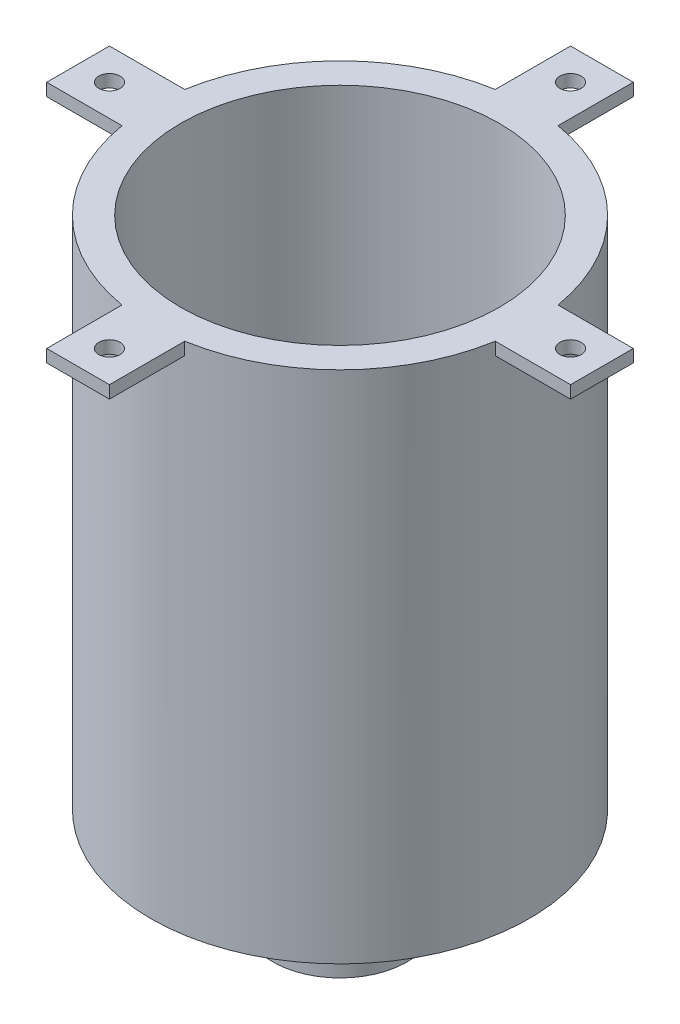
ISO-10303-21;
HEADER;
FILE_DESCRIPTION(('STEP AP214'),'2;1');
FILE_NAME('part.step','',(''),(''),'','','');
FILE_SCHEMA(('AUTOMOTIVE_DESIGN { 1 0 10303 214 1 1 1 1 }'));
ENDSEC;
DATA;
#1=APPLICATION_CONTEXT('core data for automotive mechanical design processes');
#2=APPLICATION_PROTOCOL_DEFINITION('international standard','automotive_design',2000,#1);
#3=PRODUCT_CONTEXT('',#1,'mechanical');
#4=PRODUCT('Part','Part','',(#3));
#5=PRODUCT_RELATED_PRODUCT_CATEGORY('part','',(#4));
#6=PRODUCT_DEFINITION_FORMATION('','',#4);
#7=PRODUCT_DEFINITION_CONTEXT('part definition',#1,'design');
#8=PRODUCT_DEFINITION('design','',#6,#7);
#9=PRODUCT_DEFINITION_SHAPE('','',#8);
#10=(LENGTH_UNIT() NAMED_UNIT(*) SI_UNIT(.MILLI.,.METRE.));
#11=(NAMED_UNIT(*) PLANE_ANGLE_UNIT() SI_UNIT($,.RADIAN.));
#12=(NAMED_UNIT(*) SI_UNIT($,.STERADIAN.) SOLID_ANGLE_UNIT());
#13=UNCERTAINTY_MEASURE_WITH_UNIT(LENGTH_MEASURE(1.E-05),#10,'distance_accuracy_value','');
#14=(GEOMETRIC_REPRESENTATION_CONTEXT(3) GLOBAL_UNCERTAINTY_ASSIGNED_CONTEXT((#13)) GLOBAL_UNIT_ASSIGNED_CONTEXT((#10,
#11,#12)) REPRESENTATION_CONTEXT('',''));
#15=CARTESIAN_POINT('',(0.,0.,0.));
#16=DIRECTION('',(0.,0.,1.));
#17=DIRECTION('',(1.,0.,0.));
#18=AXIS2_PLACEMENT_3D('',#15,#16,#17);
#19=CARTESIAN_POINT('',(0.,17.7,0.));
#20=DIRECTION('',(0.,1.,0.));
#21=DIRECTION('',(0.,0.,1.));
#22=AXIS2_PLACEMENT_3D('',#19,#20,#21);
#23=PLANE('',#22);
#24=CARTESIAN_POINT('',(0.,17.7,0.));
#25=DIRECTION('',(0.,1.,0.));
#26=DIRECTION('',(0.,0.,1.));
#27=AXIS2_PLACEMENT_3D('',#24,#25,#26);
#28=CIRCLE('',#27,7.874);
#29=CARTESIAN_POINT('',(0.,17.7,7.874));
#30=VERTEX_POINT('',#29);
#31=EDGE_CURVE('E301',#30,#30,#28,.T.);
#32=ORIENTED_EDGE('',*,*,#31,.F.);
#33=EDGE_LOOP('',(#32));
#34=FACE_BOUND('',#33,.T.);
#35=CARTESIAN_POINT('',(0.,17.7,0.));
#36=DIRECTION('',(0.,1.,0.));
#37=DIRECTION('',(0.,0.,1.));
#38=AXIS2_PLACEMENT_3D('',#35,#36,#37);
#39=CIRCLE('',#38,25.4);
#40=CARTESIAN_POINT('',(0.,17.7,25.4));
#41=VERTEX_POINT('',#40);
#42=EDGE_CURVE('E12',#41,#41,#39,.F.);
#43=ORIENTED_EDGE('',*,*,#42,.F.);
#44=EDGE_LOOP('',(#43));
#45=FACE_BOUND('',#44,.T.);
#46=ADVANCED_FACE('F36',(#34,#45),#23,.T.);
#47=CARTESIAN_POINT('',(0.,47.701,0.));
#48=DIRECTION('',(0.,-1.,0.));
#49=DIRECTION('',(0.,0.,-1.));
#50=AXIS2_PLACEMENT_3D('',#47,#48,#49);
#51=CYLINDRICAL_SURFACE('',#50,10.705);
#52=CARTESIAN_POINT('',(0.,0.,0.));
#53=DIRECTION('',(0.,-1.,0.));
#54=DIRECTION('',(0.,0.,-1.));
#55=AXIS2_PLACEMENT_3D('',#52,#53,#54);
#56=CIRCLE('',#55,10.705);
#57=CARTESIAN_POINT('',(0.,0.,-10.705));
#58=VERTEX_POINT('',#57);
#59=EDGE_CURVE('E44',#58,#58,#56,.T.);
#60=ORIENTED_EDGE('',*,*,#59,.F.);
#61=EDGE_LOOP('',(#60));
#62=FACE_BOUND('',#61,.T.);
#63=CARTESIAN_POINT('',(0.,15.7,0.));
#64=DIRECTION('',(0.,1.,0.));
#65=DIRECTION('',(0.,0.,1.));
#66=AXIS2_PLACEMENT_3D('',#63,#64,#65);
#67=CIRCLE('',#66,10.705);
#68=CARTESIAN_POINT('',(0.,15.7,10.705));
#69=VERTEX_POINT('',#68);
#70=EDGE_CURVE('E308',#69,#69,#67,.F.);
#71=ORIENTED_EDGE('',*,*,#70,.T.);
#72=EDGE_LOOP('',(#71));
#73=FACE_BOUND('',#72,.T.);
#74=ADVANCED_FACE('F317',(#62,#73),#51,.T.);
#75=CARTESIAN_POINT('',(0.,47.701,0.));
#76=DIRECTION('',(0.,-1.,0.));
#77=DIRECTION('',(0.,0.,-1.));
#78=AXIS2_PLACEMENT_3D('',#75,#76,#77);
#79=CYLINDRICAL_SURFACE('',#78,7.874);
#80=CARTESIAN_POINT('',(0.,0.,0.));
#81=DIRECTION('',(0.,-1.,0.));
#82=DIRECTION('',(0.,0.,-1.));
#83=AXIS2_PLACEMENT_3D('',#80,#81,#82);
#84=CIRCLE('',#83,7.874);
#85=CARTESIAN_POINT('',(0.,0.,-7.874));
#86=VERTEX_POINT('',#85);
#87=EDGE_CURVE('E311',#86,#86,#84,.T.);
#88=ORIENTED_EDGE('',*,*,#87,.T.);
#89=EDGE_LOOP('',(#88));
#90=FACE_BOUND('',#89,.T.);
#91=ORIENTED_EDGE('',*,*,#31,.T.);
#92=EDGE_LOOP('',(#91));
#93=FACE_BOUND('',#92,.T.);
#94=ADVANCED_FACE('F320',(#90,#93),#79,.F.);
#95=CARTESIAN_POINT('',(8.3,0.,0.));
#96=DIRECTION('',(0.,-1.,0.));
#97=DIRECTION('',(0.,0.,-1.));
#98=AXIS2_PLACEMENT_3D('',#95,#96,#97);
#99=PLANE('',#98);
#100=ORIENTED_EDGE('',*,*,#87,.F.);
#101=EDGE_LOOP('',(#100));
#102=FACE_BOUND('',#101,.T.);
#103=ORIENTED_EDGE('',*,*,#59,.T.);
#104=EDGE_LOOP('',(#103));
#105=FACE_BOUND('',#104,.T.);
#106=ADVANCED_FACE('F38',(#102,#105),#99,.T.);
#107=CARTESIAN_POINT('',(0.,15.7,0.));
#108=DIRECTION('',(0.,1.,0.));
#109=DIRECTION('',(0.,0.,1.));
#110=AXIS2_PLACEMENT_3D('',#107,#108,#109);
#111=PLANE('',#110);
#112=ORIENTED_EDGE('',*,*,#70,.F.);
#113=EDGE_LOOP('',(#112));
#114=FACE_BOUND('',#113,.T.);
#115=CARTESIAN_POINT('',(0.,15.7,0.));
#116=DIRECTION('',(0.,1.,0.));
#117=DIRECTION('',(0.,0.,1.));
#118=AXIS2_PLACEMENT_3D('',#115,#116,#117);
#119=CIRCLE('',#118,30.1625);
#120=CARTESIAN_POINT('',(0.,15.7,30.1625));
#121=VERTEX_POINT('',#120);
#122=EDGE_CURVE('E305',#121,#121,#119,.T.);
#123=ORIENTED_EDGE('',*,*,#122,.F.);
#124=EDGE_LOOP('',(#123));
#125=FACE_BOUND('',#124,.T.);
#126=ADVANCED_FACE('F323',(#114,#125),#111,.F.);
#127=CARTESIAN_POINT('',(0.,17.7,0.));
#128=DIRECTION('',(0.,-1.,0.));
#129=DIRECTION('',(0.,0.,-1.));
#130=AXIS2_PLACEMENT_3D('',#127,#128,#129);
#131=CYLINDRICAL_SURFACE('',#130,30.1625);
#132=CARTESIAN_POINT('',(0.,95.7,0.));
#133=DIRECTION('',(0.,1.,0.));
#134=DIRECTION('',(0.,0.,1.));
#135=AXIS2_PLACEMENT_3D('',#132,#133,#134);
#136=CIRCLE('',#135,30.1625);
#137=CARTESIAN_POINT('',(5.00000000000002,95.7,-29.7451913130509));
#138=VERTEX_POINT('',#137);
#139=CARTESIAN_POINT('',(-5.00000000000002,95.7,-29.7451913130509));
#140=VERTEX_POINT('',#139);
#141=EDGE_CURVE('E156',#138,#140,#136,.T.);
#142=ORIENTED_EDGE('',*,*,#141,.F.);
#143=DIRECTION('',(0.,1.,0.));
#144=VECTOR('',#143,1.);
#145=CARTESIAN_POINT('',(5.00000000000002,95.7,-29.7451913130509));
#146=LINE('',#145,#144);
#147=CARTESIAN_POINT('',(5.00000000000002,97.7,-29.7451913130509));
#148=VERTEX_POINT('',#147);
#149=EDGE_CURVE('E189',#138,#148,#146,.T.);
#150=ORIENTED_EDGE('',*,*,#149,.T.);
#151=CARTESIAN_POINT('',(0.,97.7,0.));
#152=DIRECTION('',(0.,1.,0.));
#153=DIRECTION('',(0.,0.,1.));
#154=AXIS2_PLACEMENT_3D('',#151,#152,#153);
#155=CIRCLE('',#154,30.1625);
#156=CARTESIAN_POINT('',(29.7451913130509,97.7,-5.));
#157=VERTEX_POINT('',#156);
#158=EDGE_CURVE('E622',#157,#148,#155,.T.);
#159=ORIENTED_EDGE('',*,*,#158,.F.);
#160=DIRECTION('',(0.,1.,0.));
#161=VECTOR('',#160,1.);
#162=CARTESIAN_POINT('',(29.7451913130509,95.7,-5.));
#163=LINE('',#162,#161);
#164=CARTESIAN_POINT('',(29.7451913130509,95.7,-5.));
#165=VERTEX_POINT('',#164);
#166=EDGE_CURVE('E221',#165,#157,#163,.T.);
#167=ORIENTED_EDGE('',*,*,#166,.F.);
#168=CARTESIAN_POINT('',(0.,95.7,0.));
#169=DIRECTION('',(0.,1.,0.));
#170=DIRECTION('',(0.,0.,1.));
#171=AXIS2_PLACEMENT_3D('',#168,#169,#170);
#172=CIRCLE('',#171,30.1625);
#173=CARTESIAN_POINT('',(29.7451913130509,95.7,5.));
#174=VERTEX_POINT('',#173);
#175=EDGE_CURVE('E201',#174,#165,#172,.T.);
#176=ORIENTED_EDGE('',*,*,#175,.F.);
#177=DIRECTION('',(0.,1.,0.));
#178=VECTOR('',#177,1.);
#179=CARTESIAN_POINT('',(29.7451913130509,95.7,5.));
#180=LINE('',#179,#178);
#181=CARTESIAN_POINT('',(29.7451913130509,97.7,5.));
#182=VERTEX_POINT('',#181);
#183=EDGE_CURVE('E218',#174,#182,#180,.T.);
#184=ORIENTED_EDGE('',*,*,#183,.T.);
#185=CARTESIAN_POINT('',(5.00000000000002,97.7,29.7451913130509));
#186=VERTEX_POINT('',#185);
#187=EDGE_CURVE('E302',#186,#182,#155,.T.);
#188=ORIENTED_EDGE('',*,*,#187,.F.);
#189=DIRECTION('',(0.,1.,0.));
#190=VECTOR('',#189,1.);
#191=CARTESIAN_POINT('',(5.,95.7,29.7451913130509));
#192=LINE('',#191,#190);
#193=CARTESIAN_POINT('',(5.,95.7,29.7451913130509));
#194=VERTEX_POINT('',#193);
#195=EDGE_CURVE('E255',#194,#186,#192,.T.);
#196=ORIENTED_EDGE('',*,*,#195,.F.);
#197=CARTESIAN_POINT('',(0.,95.7,0.));
#198=DIRECTION('',(0.,1.,0.));
#199=DIRECTION('',(0.,0.,1.));
#200=AXIS2_PLACEMENT_3D('',#197,#198,#199);
#201=CIRCLE('',#200,30.1625);
#202=CARTESIAN_POINT('',(-5.,95.7,29.7451913130509));
#203=VERTEX_POINT('',#202);
#204=EDGE_CURVE('E237',#203,#194,#201,.T.);
#205=ORIENTED_EDGE('',*,*,#204,.F.);
#206=DIRECTION('',(0.,1.,0.));
#207=VECTOR('',#206,1.);
#208=CARTESIAN_POINT('',(-5.,95.7,29.7451913130509));
#209=LINE('',#208,#207);
#210=CARTESIAN_POINT('',(-5.,97.7,29.7451913130509));
#211=VERTEX_POINT('',#210);
#212=EDGE_CURVE('E251',#203,#211,#209,.T.);
#213=ORIENTED_EDGE('',*,*,#212,.T.);
#214=CARTESIAN_POINT('',(-29.7451913130509,97.7,5.00000000000002));
#215=VERTEX_POINT('',#214);
#216=EDGE_CURVE('E298',#215,#211,#155,.T.);
#217=ORIENTED_EDGE('',*,*,#216,.F.);
#218=DIRECTION('',(0.,1.,0.));
#219=VECTOR('',#218,1.);
#220=CARTESIAN_POINT('',(-29.7451913130509,95.7,4.99999999999997));
#221=LINE('',#220,#219);
#222=CARTESIAN_POINT('',(-29.7451913130509,95.7,4.99999999999997));
#223=VERTEX_POINT('',#222);
#224=EDGE_CURVE('E290',#223,#215,#221,.T.);
#225=ORIENTED_EDGE('',*,*,#224,.F.);
#226=CARTESIAN_POINT('',(0.,95.7,0.));
#227=DIRECTION('',(0.,1.,0.));
#228=DIRECTION('',(0.,0.,1.));
#229=AXIS2_PLACEMENT_3D('',#226,#227,#228);
#230=CIRCLE('',#229,30.1625);
#231=CARTESIAN_POINT('',(-29.7451913130509,95.7,-4.99999999999997));
#232=VERTEX_POINT('',#231);
#233=EDGE_CURVE('E272',#232,#223,#230,.T.);
#234=ORIENTED_EDGE('',*,*,#233,.F.);
#235=DIRECTION('',(0.,1.,0.));
#236=VECTOR('',#235,1.);
#237=CARTESIAN_POINT('',(-29.7451913130509,95.7,-4.99999999999997));
#238=LINE('',#237,#236);
#239=CARTESIAN_POINT('',(-29.7451913130509,97.7,-4.99999999999997));
#240=VERTEX_POINT('',#239);
#241=EDGE_CURVE('E286',#232,#240,#238,.T.);
#242=ORIENTED_EDGE('',*,*,#241,.T.);
#243=CARTESIAN_POINT('',(-5.00000000000002,97.7,-29.7451913130509));
#244=VERTEX_POINT('',#243);
#245=EDGE_CURVE('E297',#244,#240,#155,.T.);
#246=ORIENTED_EDGE('',*,*,#245,.F.);
#247=DIRECTION('',(0.,1.,0.));
#248=VECTOR('',#247,1.);
#249=CARTESIAN_POINT('',(-5.00000000000002,95.7,-29.7451913130509));
#250=LINE('',#249,#248);
#251=EDGE_CURVE('E165',#140,#244,#250,.T.);
#252=ORIENTED_EDGE('',*,*,#251,.F.);
#253=EDGE_LOOP('',(#142,#150,#159,#167,#176,#184,#188,#196,#205,#213,#217,#225,#234,#242,#246,#252));
#254=FACE_BOUND('',#253,.T.);
#255=ORIENTED_EDGE('',*,*,#122,.T.);
#256=EDGE_LOOP('',(#255));
#257=FACE_BOUND('',#256,.T.);
#258=ADVANCED_FACE('F326',(#254,#257),#131,.T.);
#259=CARTESIAN_POINT('',(0.,97.7,0.));
#260=DIRECTION('',(0.,1.,0.));
#261=DIRECTION('',(0.,0.,1.));
#262=AXIS2_PLACEMENT_3D('',#259,#260,#261);
#263=PLANE('',#262);
#264=ORIENTED_EDGE('',*,*,#216,.T.);
#265=DIRECTION('',(0.,0.,1.));
#266=VECTOR('',#265,1.);
#267=CARTESIAN_POINT('',(-5.00000000000001,97.7,0.));
#268=LINE('',#267,#266);
#269=CARTESIAN_POINT('',(-5.00000000000002,97.7,41.7451913130509));
#270=VERTEX_POINT('',#269);
#271=EDGE_CURVE('E243',#211,#270,#268,.T.);
#272=ORIENTED_EDGE('',*,*,#271,.T.);
#273=DIRECTION('',(1.,0.,0.));
#274=VECTOR('',#273,1.);
#275=CARTESIAN_POINT('',(0.,97.7,41.7451913130509));
#276=LINE('',#275,#274);
#277=CARTESIAN_POINT('',(5.00000000000002,97.7,41.7451913130509));
#278=VERTEX_POINT('',#277);
#279=EDGE_CURVE('E246',#270,#278,#276,.T.);
#280=ORIENTED_EDGE('',*,*,#279,.T.);
#281=DIRECTION('',(0.,0.,1.));
#282=VECTOR('',#281,1.);
#283=CARTESIAN_POINT('',(5.00000000000001,97.7,0.));
#284=LINE('',#283,#282);
#285=EDGE_CURVE('E229',#186,#278,#284,.T.);
#286=ORIENTED_EDGE('',*,*,#285,.F.);
#287=ORIENTED_EDGE('',*,*,#187,.T.);
#288=DIRECTION('',(1.,0.,0.));
#289=VECTOR('',#288,1.);
#290=CARTESIAN_POINT('',(0.,97.7,5.00000000000001));
#291=LINE('',#290,#289);
#292=CARTESIAN_POINT('',(41.7451913130509,97.7,5.));
#293=VERTEX_POINT('',#292);
#294=EDGE_CURVE('E197',#182,#293,#291,.T.);
#295=ORIENTED_EDGE('',*,*,#294,.T.);
#296=DIRECTION('',(0.,0.,1.));
#297=VECTOR('',#296,1.);
#298=CARTESIAN_POINT('',(41.7451913130509,97.7,0.));
#299=LINE('',#298,#297);
#300=CARTESIAN_POINT('',(41.7451913130509,97.7,-5.));
#301=VERTEX_POINT('',#300);
#302=EDGE_CURVE('E209',#301,#293,#299,.T.);
#303=ORIENTED_EDGE('',*,*,#302,.F.);
#304=DIRECTION('',(1.,0.,0.));
#305=VECTOR('',#304,1.);
#306=CARTESIAN_POINT('',(0.,97.7,-5.00000000000001));
#307=LINE('',#306,#305);
#308=EDGE_CURVE('E58',#157,#301,#307,.T.);
#309=ORIENTED_EDGE('',*,*,#308,.F.);
#310=ORIENTED_EDGE('',*,*,#158,.T.);
#311=DIRECTION('',(0.,0.,-1.));
#312=VECTOR('',#311,1.);
#313=CARTESIAN_POINT('',(5.00000000000002,97.7,0.));
#314=LINE('',#313,#312);
#315=CARTESIAN_POINT('',(5.00000000000002,97.7,-41.7451913130509));
#316=VERTEX_POINT('',#315);
#317=EDGE_CURVE('E174',#148,#316,#314,.T.);
#318=ORIENTED_EDGE('',*,*,#317,.T.);
#319=DIRECTION('',(1.,0.,0.));
#320=VECTOR('',#319,1.);
#321=CARTESIAN_POINT('',(0.,97.7,-41.7451913130509));
#322=LINE('',#321,#320);
#323=CARTESIAN_POINT('',(-5.00000000000002,97.7,-41.7451913130509));
#324=VERTEX_POINT('',#323);
#325=EDGE_CURVE('E182',#324,#316,#322,.T.);
#326=ORIENTED_EDGE('',*,*,#325,.F.);
#327=DIRECTION('',(0.,0.,-1.));
#328=VECTOR('',#327,1.);
#329=CARTESIAN_POINT('',(-5.00000000000002,97.7,0.));
#330=LINE('',#329,#328);
#331=EDGE_CURVE('E51',#244,#324,#330,.T.);
#332=ORIENTED_EDGE('',*,*,#331,.F.);
#333=ORIENTED_EDGE('',*,*,#245,.T.);
#334=DIRECTION('',(-1.,0.,0.));
#335=VECTOR('',#334,1.);
#336=CARTESIAN_POINT('',(0.,97.7,-5.00000000000001));
#337=LINE('',#336,#335);
#338=CARTESIAN_POINT('',(-41.7451913130509,97.7,-5.00000000000002));
#339=VERTEX_POINT('',#338);
#340=EDGE_CURVE('E278',#240,#339,#337,.T.);
#341=ORIENTED_EDGE('',*,*,#340,.T.);
#342=DIRECTION('',(0.,0.,1.));
#343=VECTOR('',#342,1.);
#344=CARTESIAN_POINT('',(-41.7451913130509,97.7,0.));
#345=LINE('',#344,#343);
#346=CARTESIAN_POINT('',(-41.7451913130509,97.7,5.00000000000002));
#347=VERTEX_POINT('',#346);
#348=EDGE_CURVE('E281',#339,#347,#345,.T.);
#349=ORIENTED_EDGE('',*,*,#348,.T.);
#350=DIRECTION('',(-1.,0.,0.));
#351=VECTOR('',#350,1.);
#352=CARTESIAN_POINT('',(0.,97.7,5.00000000000001));
#353=LINE('',#352,#351);
#354=EDGE_CURVE('E264',#215,#347,#353,.T.);
#355=ORIENTED_EDGE('',*,*,#354,.F.);
#356=EDGE_LOOP('',(#264,#272,#280,#286,#287,#295,#303,#309,#310,#318,#326,#332,#333,#341,#349,#355));
#357=FACE_BOUND('',#356,.T.);
#358=CARTESIAN_POINT('',(0.,97.7,0.));
#359=DIRECTION('',(0.,1.,0.));
#360=DIRECTION('',(0.,0.,1.));
#361=AXIS2_PLACEMENT_3D('',#358,#359,#360);
#362=CIRCLE('',#361,25.4);
#363=CARTESIAN_POINT('',(0.,97.7,25.4));
#364=VERTEX_POINT('',#363);
#365=EDGE_CURVE('E289',#364,#364,#362,.T.);
#366=ORIENTED_EDGE('',*,*,#365,.F.);
#367=EDGE_LOOP('',(#366));
#368=FACE_BOUND('',#367,.T.);
#369=CARTESIAN_POINT('',(-36.7451913130509,97.7,0.));
#370=DIRECTION('',(0.,1.,0.));
#371=DIRECTION('',(0.,0.,1.));
#372=AXIS2_PLACEMENT_3D('',#369,#370,#371);
#373=CIRCLE('',#372,1.7);
#374=CARTESIAN_POINT('',(-36.7451913130509,97.7,1.7));
#375=VERTEX_POINT('',#374);
#376=EDGE_CURVE('E254',#375,#375,#373,.T.);
#377=ORIENTED_EDGE('',*,*,#376,.F.);
#378=EDGE_LOOP('',(#377));
#379=FACE_BOUND('',#378,.T.);
#380=CARTESIAN_POINT('',(0.,97.7,36.7451913130509));
#381=DIRECTION('',(0.,1.,0.));
#382=DIRECTION('',(0.,0.,1.));
#383=AXIS2_PLACEMENT_3D('',#380,#381,#382);
#384=CIRCLE('',#383,1.7);
#385=CARTESIAN_POINT('',(0.,97.7,38.4451913130509));
#386=VERTEX_POINT('',#385);
#387=EDGE_CURVE('E217',#386,#386,#384,.T.);
#388=ORIENTED_EDGE('',*,*,#387,.F.);
#389=EDGE_LOOP('',(#388));
#390=FACE_BOUND('',#389,.T.);
#391=CARTESIAN_POINT('',(36.7451913130509,97.7,0.));
#392=DIRECTION('',(0.,1.,0.));
#393=DIRECTION('',(0.,0.,1.));
#394=AXIS2_PLACEMENT_3D('',#391,#392,#393);
#395=CIRCLE('',#394,1.7);
#396=CARTESIAN_POINT('',(36.7451913130509,97.7,1.7));
#397=VERTEX_POINT('',#396);
#398=EDGE_CURVE('E188',#397,#397,#395,.T.);
#399=ORIENTED_EDGE('',*,*,#398,.F.);
#400=EDGE_LOOP('',(#399));
#401=FACE_BOUND('',#400,.T.);
#402=CARTESIAN_POINT('',(0.,97.7,-36.7451913130509));
#403=DIRECTION('',(0.,1.,0.));
#404=DIRECTION('',(0.,0.,1.));
#405=AXIS2_PLACEMENT_3D('',#402,#403,#404);
#406=CIRCLE('',#405,1.7);
#407=CARTESIAN_POINT('',(0.,97.7,-35.0451913130509));
#408=VERTEX_POINT('',#407);
#409=EDGE_CURVE('E179',#408,#408,#406,.T.);
#410=ORIENTED_EDGE('',*,*,#409,.F.);
#411=EDGE_LOOP('',(#410));
#412=FACE_BOUND('',#411,.T.);
#413=ADVANCED_FACE('F331',(#357,#368,#379,#390,#401,#412),#263,.T.);
#414=CARTESIAN_POINT('',(0.,97.7,0.));
#415=DIRECTION('',(0.,-1.,0.));
#416=DIRECTION('',(0.,0.,-1.));
#417=AXIS2_PLACEMENT_3D('',#414,#415,#416);
#418=CYLINDRICAL_SURFACE('',#417,25.4);
#419=ORIENTED_EDGE('',*,*,#365,.T.);
#420=EDGE_LOOP('',(#419));
#421=FACE_BOUND('',#420,.T.);
#422=ORIENTED_EDGE('',*,*,#42,.T.);
#423=EDGE_LOOP('',(#422));
#424=FACE_BOUND('',#423,.T.);
#425=ADVANCED_FACE('F337',(#421,#424),#418,.F.);
#426=CARTESIAN_POINT('',(0.,95.7,-5.00000000000001));
#427=DIRECTION('',(0.,0.,-1.));
#428=DIRECTION('',(-1.,0.,0.));
#429=AXIS2_PLACEMENT_3D('',#426,#427,#428);
#430=PLANE('',#429);
#431=ORIENTED_EDGE('',*,*,#340,.F.);
#432=ORIENTED_EDGE('',*,*,#241,.F.);
#433=DIRECTION('',(-1.,0.,0.));
#434=VECTOR('',#433,1.);
#435=CARTESIAN_POINT('',(0.,95.7,-5.00000000000001));
#436=LINE('',#435,#434);
#437=CARTESIAN_POINT('',(-41.7451913130509,95.7,-5.00000000000002));
#438=VERTEX_POINT('',#437);
#439=EDGE_CURVE('E263',#232,#438,#436,.T.);
#440=ORIENTED_EDGE('',*,*,#439,.T.);
#441=DIRECTION('',(0.,1.,0.));
#442=VECTOR('',#441,1.);
#443=CARTESIAN_POINT('',(-41.7451913130509,95.7,-5.00000000000002));
#444=LINE('',#443,#442);
#445=EDGE_CURVE('E275',#438,#339,#444,.T.);
#446=ORIENTED_EDGE('',*,*,#445,.T.);
#447=EDGE_LOOP('',(#431,#432,#440,#446));
#448=FACE_BOUND('',#447,.T.);
#449=ADVANCED_FACE('F350',(#448),#430,.T.);
#450=CARTESIAN_POINT('',(0.,95.7,5.00000000000001));
#451=DIRECTION('',(0.,0.,-1.));
#452=DIRECTION('',(-1.,0.,0.));
#453=AXIS2_PLACEMENT_3D('',#450,#451,#452);
#454=PLANE('',#453);
#455=ORIENTED_EDGE('',*,*,#354,.T.);
#456=DIRECTION('',(0.,1.,0.));
#457=VECTOR('',#456,1.);
#458=CARTESIAN_POINT('',(-41.7451913130509,95.7,5.00000000000002));
#459=LINE('',#458,#457);
#460=CARTESIAN_POINT('',(-41.7451913130509,95.7,5.00000000000002));
#461=VERTEX_POINT('',#460);
#462=EDGE_CURVE('E292',#461,#347,#459,.T.);
#463=ORIENTED_EDGE('',*,*,#462,.F.);
#464=DIRECTION('',(-1.,0.,0.));
#465=VECTOR('',#464,1.);
#466=CARTESIAN_POINT('',(0.,95.7,5.00000000000001));
#467=LINE('',#466,#465);
#468=EDGE_CURVE('E270',#223,#461,#467,.T.);
#469=ORIENTED_EDGE('',*,*,#468,.F.);
#470=ORIENTED_EDGE('',*,*,#224,.T.);
#471=EDGE_LOOP('',(#455,#463,#469,#470));
#472=FACE_BOUND('',#471,.T.);
#473=ADVANCED_FACE('F356',(#472),#454,.F.);
#474=CARTESIAN_POINT('',(-36.7451913130509,95.7,0.));
#475=DIRECTION('',(0.,1.,0.));
#476=DIRECTION('',(0.,0.,1.));
#477=AXIS2_PLACEMENT_3D('',#474,#475,#476);
#478=CYLINDRICAL_SURFACE('',#477,1.7);
#479=CARTESIAN_POINT('',(-36.7451913130509,95.7,0.));
#480=DIRECTION('',(0.,1.,0.));
#481=DIRECTION('',(0.,0.,1.));
#482=AXIS2_PLACEMENT_3D('',#479,#480,#481);
#483=CIRCLE('',#482,1.7);
#484=CARTESIAN_POINT('',(-36.7451913130509,95.7,1.7));
#485=VERTEX_POINT('',#484);
#486=EDGE_CURVE('E260',#485,#485,#483,.T.);
#487=ORIENTED_EDGE('',*,*,#486,.F.);
#488=EDGE_LOOP('',(#487));
#489=FACE_BOUND('',#488,.T.);
#490=ORIENTED_EDGE('',*,*,#376,.T.);
#491=EDGE_LOOP('',(#490));
#492=FACE_BOUND('',#491,.T.);
#493=ADVANCED_FACE('F352',(#489,#492),#478,.F.);
#494=CARTESIAN_POINT('',(-41.7451913130509,95.7,0.));
#495=DIRECTION('',(-1.,0.,0.));
#496=DIRECTION('',(0.,0.,1.));
#497=AXIS2_PLACEMENT_3D('',#494,#495,#496);
#498=PLANE('',#497);
#499=ORIENTED_EDGE('',*,*,#348,.F.);
#500=ORIENTED_EDGE('',*,*,#445,.F.);
#501=DIRECTION('',(0.,0.,1.));
#502=VECTOR('',#501,1.);
#503=CARTESIAN_POINT('',(-41.7451913130509,95.7,0.));
#504=LINE('',#503,#502);
#505=EDGE_CURVE('E267',#438,#461,#504,.T.);
#506=ORIENTED_EDGE('',*,*,#505,.T.);
#507=ORIENTED_EDGE('',*,*,#462,.T.);
#508=EDGE_LOOP('',(#499,#500,#506,#507));
#509=FACE_BOUND('',#508,.T.);
#510=ADVANCED_FACE('F355',(#509),#498,.T.);
#511=CARTESIAN_POINT('',(0.,95.7,0.));
#512=DIRECTION('',(0.,1.,0.));
#513=DIRECTION('',(0.,0.,1.));
#514=AXIS2_PLACEMENT_3D('',#511,#512,#513);
#515=PLANE('',#514);
#516=ORIENTED_EDGE('',*,*,#486,.T.);
#517=EDGE_LOOP('',(#516));
#518=FACE_BOUND('',#517,.T.);
#519=ORIENTED_EDGE('',*,*,#439,.F.);
#520=ORIENTED_EDGE('',*,*,#233,.T.);
#521=ORIENTED_EDGE('',*,*,#468,.T.);
#522=ORIENTED_EDGE('',*,*,#505,.F.);
#523=EDGE_LOOP('',(#519,#520,#521,#522));
#524=FACE_BOUND('',#523,.T.);
#525=ADVANCED_FACE('F363',(#518,#524),#515,.F.);
#526=CARTESIAN_POINT('',(-5.00000000000001,95.7,0.));
#527=DIRECTION('',(-1.,0.,0.));
#528=DIRECTION('',(0.,0.,1.));
#529=AXIS2_PLACEMENT_3D('',#526,#527,#528);
#530=PLANE('',#529);
#531=ORIENTED_EDGE('',*,*,#271,.F.);
#532=ORIENTED_EDGE('',*,*,#212,.F.);
#533=DIRECTION('',(0.,0.,1.));
#534=VECTOR('',#533,1.);
#535=CARTESIAN_POINT('',(-5.00000000000001,95.7,0.));
#536=LINE('',#535,#534);
#537=CARTESIAN_POINT('',(-5.00000000000002,95.7,41.7451913130509));
#538=VERTEX_POINT('',#537);
#539=EDGE_CURVE('E228',#203,#538,#536,.T.);
#540=ORIENTED_EDGE('',*,*,#539,.T.);
#541=DIRECTION('',(0.,1.,0.));
#542=VECTOR('',#541,1.);
#543=CARTESIAN_POINT('',(-5.00000000000002,95.7,41.7451913130509));
#544=LINE('',#543,#542);
#545=EDGE_CURVE('E240',#538,#270,#544,.T.);
#546=ORIENTED_EDGE('',*,*,#545,.T.);
#547=EDGE_LOOP('',(#531,#532,#540,#546));
#548=FACE_BOUND('',#547,.T.);
#549=ADVANCED_FACE('F370',(#548),#530,.T.);
#550=CARTESIAN_POINT('',(5.00000000000001,95.7,0.));
#551=DIRECTION('',(-1.,0.,0.));
#552=DIRECTION('',(0.,0.,1.));
#553=AXIS2_PLACEMENT_3D('',#550,#551,#552);
#554=PLANE('',#553);
#555=ORIENTED_EDGE('',*,*,#285,.T.);
#556=DIRECTION('',(0.,1.,0.));
#557=VECTOR('',#556,1.);
#558=CARTESIAN_POINT('',(5.00000000000002,95.7,41.7451913130509));
#559=LINE('',#558,#557);
#560=CARTESIAN_POINT('',(5.00000000000002,95.7,41.7451913130509));
#561=VERTEX_POINT('',#560);
#562=EDGE_CURVE('E257',#561,#278,#559,.T.);
#563=ORIENTED_EDGE('',*,*,#562,.F.);
#564=DIRECTION('',(0.,0.,1.));
#565=VECTOR('',#564,1.);
#566=CARTESIAN_POINT('',(5.00000000000001,95.7,0.));
#567=LINE('',#566,#565);
#568=EDGE_CURVE('E235',#194,#561,#567,.T.);
#569=ORIENTED_EDGE('',*,*,#568,.F.);
#570=ORIENTED_EDGE('',*,*,#195,.T.);
#571=EDGE_LOOP('',(#555,#563,#569,#570));
#572=FACE_BOUND('',#571,.T.);
#573=ADVANCED_FACE('F376',(#572),#554,.F.);
#574=CARTESIAN_POINT('',(0.,95.7,36.7451913130509));
#575=DIRECTION('',(0.,1.,0.));
#576=DIRECTION('',(0.,0.,1.));
#577=AXIS2_PLACEMENT_3D('',#574,#575,#576);
#578=CYLINDRICAL_SURFACE('',#577,1.7);
#579=CARTESIAN_POINT('',(0.,95.7,36.7451913130509));
#580=DIRECTION('',(0.,1.,0.));
#581=DIRECTION('',(0.,0.,1.));
#582=AXIS2_PLACEMENT_3D('',#579,#580,#581);
#583=CIRCLE('',#582,1.7);
#584=CARTESIAN_POINT('',(0.,95.7,38.4451913130509));
#585=VERTEX_POINT('',#584);
#586=EDGE_CURVE('E225',#585,#585,#583,.T.);
#587=ORIENTED_EDGE('',*,*,#586,.F.);
#588=EDGE_LOOP('',(#587));
#589=FACE_BOUND('',#588,.T.);
#590=ORIENTED_EDGE('',*,*,#387,.T.);
#591=EDGE_LOOP('',(#590));
#592=FACE_BOUND('',#591,.T.);
#593=ADVANCED_FACE('F372',(#589,#592),#578,.F.);
#594=CARTESIAN_POINT('',(0.,95.7,41.7451913130509));
#595=DIRECTION('',(0.,0.,1.));
#596=DIRECTION('',(1.,0.,0.));
#597=AXIS2_PLACEMENT_3D('',#594,#595,#596);
#598=PLANE('',#597);
#599=ORIENTED_EDGE('',*,*,#279,.F.);
#600=ORIENTED_EDGE('',*,*,#545,.F.);
#601=DIRECTION('',(1.,0.,0.));
#602=VECTOR('',#601,1.);
#603=CARTESIAN_POINT('',(0.,95.7,41.7451913130509));
#604=LINE('',#603,#602);
#605=EDGE_CURVE('E232',#538,#561,#604,.T.);
#606=ORIENTED_EDGE('',*,*,#605,.T.);
#607=ORIENTED_EDGE('',*,*,#562,.T.);
#608=EDGE_LOOP('',(#599,#600,#606,#607));
#609=FACE_BOUND('',#608,.T.);
#610=ADVANCED_FACE('F375',(#609),#598,.T.);
#611=CARTESIAN_POINT('',(0.,95.7,0.));
#612=DIRECTION('',(0.,1.,0.));
#613=DIRECTION('',(0.,0.,1.));
#614=AXIS2_PLACEMENT_3D('',#611,#612,#613);
#615=PLANE('',#614);
#616=ORIENTED_EDGE('',*,*,#586,.T.);
#617=EDGE_LOOP('',(#616));
#618=FACE_BOUND('',#617,.T.);
#619=ORIENTED_EDGE('',*,*,#539,.F.);
#620=ORIENTED_EDGE('',*,*,#204,.T.);
#621=ORIENTED_EDGE('',*,*,#568,.T.);
#622=ORIENTED_EDGE('',*,*,#605,.F.);
#623=EDGE_LOOP('',(#619,#620,#621,#622));
#624=FACE_BOUND('',#623,.T.);
#625=ADVANCED_FACE('F383',(#618,#624),#615,.F.);
#626=CARTESIAN_POINT('',(41.7451913130509,95.7,0.));
#627=DIRECTION('',(-1.,0.,0.));
#628=DIRECTION('',(0.,0.,1.));
#629=AXIS2_PLACEMENT_3D('',#626,#627,#628);
#630=PLANE('',#629);
#631=ORIENTED_EDGE('',*,*,#302,.T.);
#632=DIRECTION('',(0.,1.,0.));
#633=VECTOR('',#632,1.);
#634=CARTESIAN_POINT('',(41.7451913130509,95.7,5.));
#635=LINE('',#634,#633);
#636=CARTESIAN_POINT('',(41.7451913130509,95.7,5.));
#637=VERTEX_POINT('',#636);
#638=EDGE_CURVE('E215',#637,#293,#635,.T.);
#639=ORIENTED_EDGE('',*,*,#638,.F.);
#640=DIRECTION('',(0.,0.,1.));
#641=VECTOR('',#640,1.);
#642=CARTESIAN_POINT('',(41.7451913130509,95.7,0.));
#643=LINE('',#642,#641);
#644=CARTESIAN_POINT('',(41.7451913130509,95.7,-5.));
#645=VERTEX_POINT('',#644);
#646=EDGE_CURVE('E196',#645,#637,#643,.T.);
#647=ORIENTED_EDGE('',*,*,#646,.F.);
#648=DIRECTION('',(0.,1.,0.));
#649=VECTOR('',#648,1.);
#650=CARTESIAN_POINT('',(41.7451913130509,95.7,-5.));
#651=LINE('',#650,#649);
#652=EDGE_CURVE('E206',#645,#301,#651,.T.);
#653=ORIENTED_EDGE('',*,*,#652,.T.);
#654=EDGE_LOOP('',(#631,#639,#647,#653));
#655=FACE_BOUND('',#654,.T.);
#656=ADVANCED_FACE('F390',(#655),#630,.F.);
#657=CARTESIAN_POINT('',(0.,95.7,5.00000000000001));
#658=DIRECTION('',(0.,0.,1.));
#659=DIRECTION('',(1.,0.,0.));
#660=AXIS2_PLACEMENT_3D('',#657,#658,#659);
#661=PLANE('',#660);
#662=ORIENTED_EDGE('',*,*,#294,.F.);
#663=ORIENTED_EDGE('',*,*,#183,.F.);
#664=DIRECTION('',(1.,0.,0.));
#665=VECTOR('',#664,1.);
#666=CARTESIAN_POINT('',(0.,95.7,5.00000000000001));
#667=LINE('',#666,#665);
#668=EDGE_CURVE('E203',#174,#637,#667,.T.);
#669=ORIENTED_EDGE('',*,*,#668,.T.);
#670=ORIENTED_EDGE('',*,*,#638,.T.);
#671=EDGE_LOOP('',(#662,#663,#669,#670));
#672=FACE_BOUND('',#671,.T.);
#673=ADVANCED_FACE('F396',(#672),#661,.T.);
#674=CARTESIAN_POINT('',(36.7451913130509,95.7,0.));
#675=DIRECTION('',(0.,1.,0.));
#676=DIRECTION('',(0.,0.,1.));
#677=AXIS2_PLACEMENT_3D('',#674,#675,#676);
#678=CYLINDRICAL_SURFACE('',#677,1.7);
#679=CARTESIAN_POINT('',(36.7451913130509,95.7,0.));
#680=DIRECTION('',(0.,1.,0.));
#681=DIRECTION('',(0.,0.,1.));
#682=AXIS2_PLACEMENT_3D('',#679,#680,#681);
#683=CIRCLE('',#682,1.7);
#684=CARTESIAN_POINT('',(36.7451913130509,95.7,1.7));
#685=VERTEX_POINT('',#684);
#686=EDGE_CURVE('E193',#685,#685,#683,.T.);
#687=ORIENTED_EDGE('',*,*,#686,.F.);
#688=EDGE_LOOP('',(#687));
#689=FACE_BOUND('',#688,.T.);
#690=ORIENTED_EDGE('',*,*,#398,.T.);
#691=EDGE_LOOP('',(#690));
#692=FACE_BOUND('',#691,.T.);
#693=ADVANCED_FACE('F392',(#689,#692),#678,.F.);
#694=CARTESIAN_POINT('',(0.,95.7,-5.00000000000001));
#695=DIRECTION('',(0.,0.,1.));
#696=DIRECTION('',(1.,0.,0.));
#697=AXIS2_PLACEMENT_3D('',#694,#695,#696);
#698=PLANE('',#697);
#699=ORIENTED_EDGE('',*,*,#308,.T.);
#700=ORIENTED_EDGE('',*,*,#652,.F.);
#701=DIRECTION('',(1.,0.,0.));
#702=VECTOR('',#701,1.);
#703=CARTESIAN_POINT('',(0.,95.7,-5.00000000000001));
#704=LINE('',#703,#702);
#705=EDGE_CURVE('E199',#165,#645,#704,.T.);
#706=ORIENTED_EDGE('',*,*,#705,.F.);
#707=ORIENTED_EDGE('',*,*,#166,.T.);
#708=EDGE_LOOP('',(#699,#700,#706,#707));
#709=FACE_BOUND('',#708,.T.);
#710=ADVANCED_FACE('F395',(#709),#698,.F.);
#711=CARTESIAN_POINT('',(0.,95.7,0.));
#712=DIRECTION('',(0.,1.,0.));
#713=DIRECTION('',(0.,0.,1.));
#714=AXIS2_PLACEMENT_3D('',#711,#712,#713);
#715=PLANE('',#714);
#716=ORIENTED_EDGE('',*,*,#686,.T.);
#717=EDGE_LOOP('',(#716));
#718=FACE_BOUND('',#717,.T.);
#719=ORIENTED_EDGE('',*,*,#646,.T.);
#720=ORIENTED_EDGE('',*,*,#668,.F.);
#721=ORIENTED_EDGE('',*,*,#175,.T.);
#722=ORIENTED_EDGE('',*,*,#705,.T.);
#723=EDGE_LOOP('',(#719,#720,#721,#722));
#724=FACE_BOUND('',#723,.T.);
#725=ADVANCED_FACE('F403',(#718,#724),#715,.F.);
#726=CARTESIAN_POINT('',(0.,95.7,-41.7451913130509));
#727=DIRECTION('',(0.,0.,1.));
#728=DIRECTION('',(1.,0.,0.));
#729=AXIS2_PLACEMENT_3D('',#726,#727,#728);
#730=PLANE('',#729);
#731=ORIENTED_EDGE('',*,*,#325,.T.);
#732=DIRECTION('',(0.,1.,0.));
#733=VECTOR('',#732,1.);
#734=CARTESIAN_POINT('',(5.00000000000002,95.7,-41.7451913130509));
#735=LINE('',#734,#733);
#736=CARTESIAN_POINT('',(5.00000000000002,95.7,-41.7451913130509));
#737=VERTEX_POINT('',#736);
#738=EDGE_CURVE('E169',#737,#316,#735,.T.);
#739=ORIENTED_EDGE('',*,*,#738,.F.);
#740=DIRECTION('',(1.,0.,0.));
#741=VECTOR('',#740,1.);
#742=CARTESIAN_POINT('',(0.,95.7,-41.7451913130509));
#743=LINE('',#742,#741);
#744=CARTESIAN_POINT('',(-5.00000000000002,95.7,-41.7451913130509));
#745=VERTEX_POINT('',#744);
#746=EDGE_CURVE('E153',#745,#737,#743,.T.);
#747=ORIENTED_EDGE('',*,*,#746,.F.);
#748=DIRECTION('',(0.,1.,0.));
#749=VECTOR('',#748,1.);
#750=CARTESIAN_POINT('',(-5.00000000000002,95.7,-41.7451913130509));
#751=LINE('',#750,#749);
#752=EDGE_CURVE('E161',#745,#324,#751,.T.);
#753=ORIENTED_EDGE('',*,*,#752,.T.);
#754=EDGE_LOOP('',(#731,#739,#747,#753));
#755=FACE_BOUND('',#754,.T.);
#756=ADVANCED_FACE('F168',(#755),#730,.F.);
#757=CARTESIAN_POINT('',(5.00000000000002,95.7,0.));
#758=DIRECTION('',(1.,0.,0.));
#759=DIRECTION('',(0.,0.,-1.));
#760=AXIS2_PLACEMENT_3D('',#757,#758,#759);
#761=PLANE('',#760);
#762=ORIENTED_EDGE('',*,*,#317,.F.);
#763=ORIENTED_EDGE('',*,*,#149,.F.);
#764=DIRECTION('',(0.,0.,-1.));
#765=VECTOR('',#764,1.);
#766=CARTESIAN_POINT('',(5.00000000000002,95.7,0.));
#767=LINE('',#766,#765);
#768=EDGE_CURVE('E166',#138,#737,#767,.T.);
#769=ORIENTED_EDGE('',*,*,#768,.T.);
#770=ORIENTED_EDGE('',*,*,#738,.T.);
#771=EDGE_LOOP('',(#762,#763,#769,#770));
#772=FACE_BOUND('',#771,.T.);
#773=ADVANCED_FACE('F414',(#772),#761,.T.);
#774=CARTESIAN_POINT('',(0.,95.7,-36.7451913130509));
#775=DIRECTION('',(0.,1.,0.));
#776=DIRECTION('',(0.,0.,1.));
#777=AXIS2_PLACEMENT_3D('',#774,#775,#776);
#778=CYLINDRICAL_SURFACE('',#777,1.7);
#779=CARTESIAN_POINT('',(0.,95.7,-36.7451913130509));
#780=DIRECTION('',(0.,1.,0.));
#781=DIRECTION('',(0.,0.,1.));
#782=AXIS2_PLACEMENT_3D('',#779,#780,#781);
#783=CIRCLE('',#782,1.7);
#784=CARTESIAN_POINT('',(0.,95.7,-35.0451913130509));
#785=VERTEX_POINT('',#784);
#786=EDGE_CURVE('E171',#785,#785,#783,.T.);
#787=ORIENTED_EDGE('',*,*,#786,.F.);
#788=EDGE_LOOP('',(#787));
#789=FACE_BOUND('',#788,.T.);
#790=ORIENTED_EDGE('',*,*,#409,.T.);
#791=EDGE_LOOP('',(#790));
#792=FACE_BOUND('',#791,.T.);
#793=ADVANCED_FACE('F411',(#789,#792),#778,.F.);
#794=CARTESIAN_POINT('',(-5.00000000000002,95.7,0.));
#795=DIRECTION('',(1.,0.,0.));
#796=DIRECTION('',(0.,0.,-1.));
#797=AXIS2_PLACEMENT_3D('',#794,#795,#796);
#798=PLANE('',#797);
#799=ORIENTED_EDGE('',*,*,#331,.T.);
#800=ORIENTED_EDGE('',*,*,#752,.F.);
#801=DIRECTION('',(0.,0.,-1.));
#802=VECTOR('',#801,1.);
#803=CARTESIAN_POINT('',(-5.00000000000002,95.7,0.));
#804=LINE('',#803,#802);
#805=EDGE_CURVE('E148',#140,#745,#804,.T.);
#806=ORIENTED_EDGE('',*,*,#805,.F.);
#807=ORIENTED_EDGE('',*,*,#251,.T.);
#808=EDGE_LOOP('',(#799,#800,#806,#807));
#809=FACE_BOUND('',#808,.T.);
#810=ADVANCED_FACE('F162',(#809),#798,.F.);
#811=CARTESIAN_POINT('',(0.,95.7,0.));
#812=DIRECTION('',(0.,1.,0.));
#813=DIRECTION('',(0.,0.,1.));
#814=AXIS2_PLACEMENT_3D('',#811,#812,#813);
#815=PLANE('',#814);
#816=ORIENTED_EDGE('',*,*,#786,.T.);
#817=EDGE_LOOP('',(#816));
#818=FACE_BOUND('',#817,.T.);
#819=ORIENTED_EDGE('',*,*,#746,.T.);
#820=ORIENTED_EDGE('',*,*,#768,.F.);
#821=ORIENTED_EDGE('',*,*,#141,.T.);
#822=ORIENTED_EDGE('',*,*,#805,.T.);
#823=EDGE_LOOP('',(#819,#820,#821,#822));
#824=FACE_BOUND('',#823,.T.);
#825=ADVANCED_FACE('F150',(#818,#824),#815,.F.);
#826=CLOSED_SHELL('',(#46,#74,#94,#106,#126,#258,#413,#425,#449,#473,#493,#510,#525,#549,#573,
#593,#610,#625,#656,#673,#693,#710,#725,#756,#773,#793,#810,#825));
#827=MANIFOLD_SOLID_BREP('B2',#826);
#828=ADVANCED_BREP_SHAPE_REPRESENTATION('',(#18,#827),#14);
#829=SHAPE_DEFINITION_REPRESENTATION(#9,#828);
ENDSEC;
END-ISO-10303-21;
